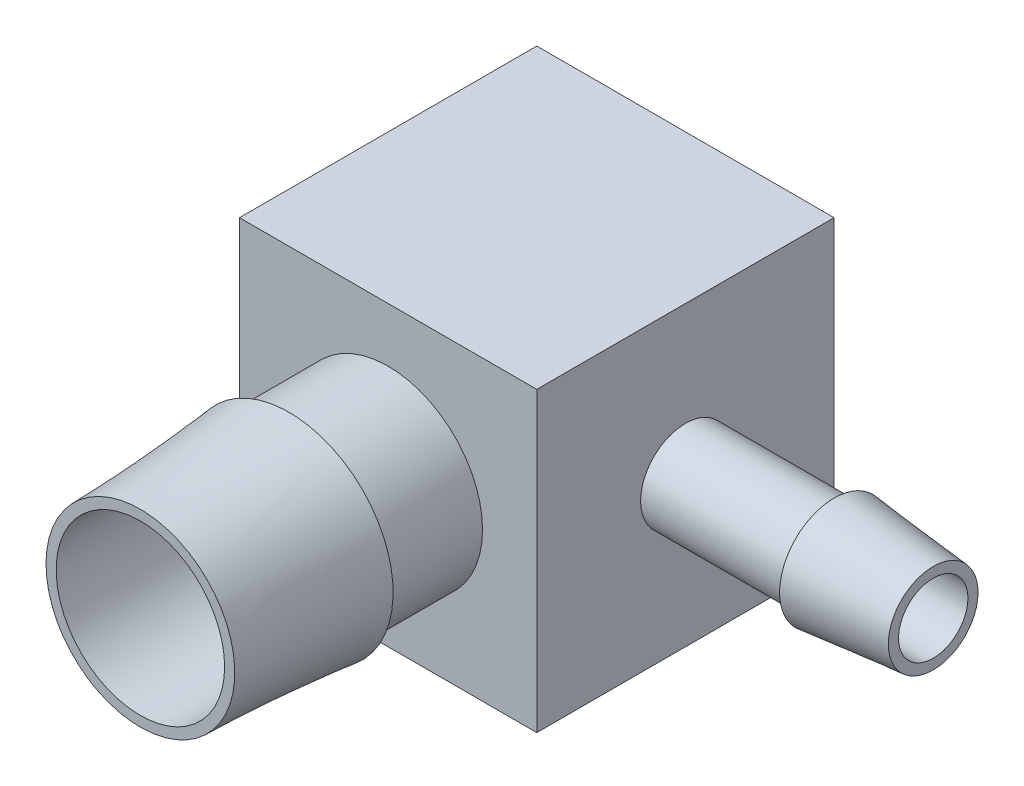
ISO-10303-21;
HEADER;
FILE_DESCRIPTION(('STEP AP214'),'2;1');
FILE_NAME('part.step','',(''),(''),'','','');
FILE_SCHEMA(('AUTOMOTIVE_DESIGN { 1 0 10303 214 1 1 1 1 }'));
ENDSEC;
DATA;
#1=APPLICATION_CONTEXT('core data for automotive mechanical design processes');
#2=APPLICATION_PROTOCOL_DEFINITION('international standard','automotive_design',2000,#1);
#3=PRODUCT_CONTEXT('',#1,'mechanical');
#4=PRODUCT('Part','Part','',(#3));
#5=PRODUCT_RELATED_PRODUCT_CATEGORY('part','',(#4));
#6=PRODUCT_DEFINITION_FORMATION('','',#4);
#7=PRODUCT_DEFINITION_CONTEXT('part definition',#1,'design');
#8=PRODUCT_DEFINITION('design','',#6,#7);
#9=PRODUCT_DEFINITION_SHAPE('','',#8);
#10=(LENGTH_UNIT() NAMED_UNIT(*) SI_UNIT(.MILLI.,.METRE.));
#11=(NAMED_UNIT(*) PLANE_ANGLE_UNIT() SI_UNIT($,.RADIAN.));
#12=(NAMED_UNIT(*) SI_UNIT($,.STERADIAN.) SOLID_ANGLE_UNIT());
#13=UNCERTAINTY_MEASURE_WITH_UNIT(LENGTH_MEASURE(1.E-05),#10,'distance_accuracy_value','');
#14=(GEOMETRIC_REPRESENTATION_CONTEXT(3) GLOBAL_UNCERTAINTY_ASSIGNED_CONTEXT((#13)) GLOBAL_UNIT_ASSIGNED_CONTEXT((#10,
#11,#12)) REPRESENTATION_CONTEXT('',''));
#15=CARTESIAN_POINT('',(0.,0.,0.));
#16=DIRECTION('',(0.,0.,1.));
#17=DIRECTION('',(1.,0.,0.));
#18=AXIS2_PLACEMENT_3D('',#15,#16,#17);
#19=CARTESIAN_POINT('',(40.,0.,0.));
#20=DIRECTION('',(-1.,0.,0.));
#21=DIRECTION('',(0.,-1.,0.));
#22=AXIS2_PLACEMENT_3D('',#19,#20,#21);
#23=CYLINDRICAL_SURFACE('',#22,4.525);
#24=CARTESIAN_POINT('',(15.,0.,0.));
#25=DIRECTION('',(1.,0.,0.));
#26=DIRECTION('',(0.,1.,0.));
#27=AXIS2_PLACEMENT_3D('',#24,#25,#26);
#28=CIRCLE('',#27,4.525);
#29=CARTESIAN_POINT('',(15.,4.525,0.));
#30=VERTEX_POINT('',#29);
#31=EDGE_CURVE('E49',#30,#30,#28,.T.);
#32=ORIENTED_EDGE('',*,*,#31,.T.);
#33=EDGE_LOOP('',(#32));
#34=FACE_BOUND('',#33,.T.);
#35=CARTESIAN_POINT('',(30.,0.,0.));
#36=DIRECTION('',(1.,0.,0.));
#37=DIRECTION('',(0.,1.,0.));
#38=AXIS2_PLACEMENT_3D('',#35,#36,#37);
#39=CIRCLE('',#38,4.525);
#40=CARTESIAN_POINT('',(30.,4.52500000000001,0.));
#41=VERTEX_POINT('',#40);
#42=EDGE_CURVE('E12',#41,#41,#39,.T.);
#43=ORIENTED_EDGE('',*,*,#42,.F.);
#44=EDGE_LOOP('',(#43));
#45=FACE_BOUND('',#44,.T.);
#46=ADVANCED_FACE('F40',(#34,#45),#23,.T.);
#47=CARTESIAN_POINT('',(13.,15.,15.));
#48=DIRECTION('',(-1.,0.,0.));
#49=DIRECTION('',(0.,-1.,0.));
#50=AXIS2_PLACEMENT_3D('',#47,#48,#49);
#51=PLANE('',#50);
#52=CARTESIAN_POINT('',(13.,0.,0.));
#53=DIRECTION('',(-1.,0.,0.));
#54=DIRECTION('',(0.,-1.,0.));
#55=AXIS2_PLACEMENT_3D('',#52,#53,#54);
#56=CIRCLE('',#55,3.5);
#57=CARTESIAN_POINT('',(13.,-3.5,0.));
#58=VERTEX_POINT('',#57);
#59=EDGE_CURVE('E202',#58,#58,#56,.T.);
#60=ORIENTED_EDGE('',*,*,#59,.F.);
#61=EDGE_LOOP('',(#60));
#62=FACE_BOUND('',#61,.T.);
#63=DIRECTION('',(0.,1.,0.));
#64=VECTOR('',#63,1.);
#65=CARTESIAN_POINT('',(13.,15.,-13.));
#66=LINE('',#65,#64);
#67=CARTESIAN_POINT('',(13.,-13.,-13.));
#68=VERTEX_POINT('',#67);
#69=CARTESIAN_POINT('',(13.,13.,-13.));
#70=VERTEX_POINT('',#69);
#71=EDGE_CURVE('E154',#68,#70,#66,.T.);
#72=ORIENTED_EDGE('',*,*,#71,.F.);
#73=DIRECTION('',(0.,0.,-1.));
#74=VECTOR('',#73,1.);
#75=CARTESIAN_POINT('',(13.,-13.,15.));
#76=LINE('',#75,#74);
#77=CARTESIAN_POINT('',(13.,-13.,13.));
#78=VERTEX_POINT('',#77);
#79=EDGE_CURVE('E175',#78,#68,#76,.T.);
#80=ORIENTED_EDGE('',*,*,#79,.F.);
#81=DIRECTION('',(0.,1.,0.));
#82=VECTOR('',#81,1.);
#83=CARTESIAN_POINT('',(13.,15.,13.));
#84=LINE('',#83,#82);
#85=CARTESIAN_POINT('',(13.,13.,13.));
#86=VERTEX_POINT('',#85);
#87=EDGE_CURVE('E161',#78,#86,#84,.T.);
#88=ORIENTED_EDGE('',*,*,#87,.T.);
#89=DIRECTION('',(0.,0.,-1.));
#90=VECTOR('',#89,1.);
#91=CARTESIAN_POINT('',(13.,13.,15.));
#92=LINE('',#91,#90);
#93=EDGE_CURVE('E172',#86,#70,#92,.T.);
#94=ORIENTED_EDGE('',*,*,#93,.T.);
#95=EDGE_LOOP('',(#72,#80,#88,#94));
#96=FACE_BOUND('',#95,.T.);
#97=ADVANCED_FACE('F311',(#62,#96),#51,.T.);
#98=CARTESIAN_POINT('',(-15.,13.,15.));
#99=DIRECTION('',(0.,-1.,0.));
#100=DIRECTION('',(0.,0.,-1.));
#101=AXIS2_PLACEMENT_3D('',#98,#99,#100);
#102=PLANE('',#101);
#103=DIRECTION('',(-1.,0.,0.));
#104=VECTOR('',#103,1.);
#105=CARTESIAN_POINT('',(-15.,13.,-13.));
#106=LINE('',#105,#104);
#107=CARTESIAN_POINT('',(-13.,13.,-13.));
#108=VERTEX_POINT('',#107);
#109=EDGE_CURVE('E57',#70,#108,#106,.T.);
#110=ORIENTED_EDGE('',*,*,#109,.F.);
#111=ORIENTED_EDGE('',*,*,#93,.F.);
#112=DIRECTION('',(-1.,0.,0.));
#113=VECTOR('',#112,1.);
#114=CARTESIAN_POINT('',(-15.,13.,13.));
#115=LINE('',#114,#113);
#116=CARTESIAN_POINT('',(-13.,13.,13.));
#117=VERTEX_POINT('',#116);
#118=EDGE_CURVE('E81',#86,#117,#115,.T.);
#119=ORIENTED_EDGE('',*,*,#118,.T.);
#120=DIRECTION('',(0.,0.,-1.));
#121=VECTOR('',#120,1.);
#122=CARTESIAN_POINT('',(-13.,13.,15.));
#123=LINE('',#122,#121);
#124=EDGE_CURVE('E168',#117,#108,#123,.T.);
#125=ORIENTED_EDGE('',*,*,#124,.T.);
#126=EDGE_LOOP('',(#110,#111,#119,#125));
#127=FACE_BOUND('',#126,.T.);
#128=ADVANCED_FACE('F316',(#127),#102,.T.);
#129=CARTESIAN_POINT('',(-13.,15.,15.));
#130=DIRECTION('',(1.,0.,0.));
#131=DIRECTION('',(0.,1.,0.));
#132=AXIS2_PLACEMENT_3D('',#129,#130,#131);
#133=PLANE('',#132);
#134=DIRECTION('',(0.,-1.,0.));
#135=VECTOR('',#134,1.);
#136=CARTESIAN_POINT('',(-13.,15.,-13.));
#137=LINE('',#136,#135);
#138=CARTESIAN_POINT('',(-13.,-13.,-13.));
#139=VERTEX_POINT('',#138);
#140=EDGE_CURVE('E170',#108,#139,#137,.T.);
#141=ORIENTED_EDGE('',*,*,#140,.F.);
#142=ORIENTED_EDGE('',*,*,#124,.F.);
#143=DIRECTION('',(0.,-1.,0.));
#144=VECTOR('',#143,1.);
#145=CARTESIAN_POINT('',(-13.,15.,13.));
#146=LINE('',#145,#144);
#147=CARTESIAN_POINT('',(-13.,-13.,13.));
#148=VERTEX_POINT('',#147);
#149=EDGE_CURVE('E158',#117,#148,#146,.T.);
#150=ORIENTED_EDGE('',*,*,#149,.T.);
#151=DIRECTION('',(0.,0.,-1.));
#152=VECTOR('',#151,1.);
#153=CARTESIAN_POINT('',(-13.,-13.,15.));
#154=LINE('',#153,#152);
#155=EDGE_CURVE('E163',#148,#139,#154,.T.);
#156=ORIENTED_EDGE('',*,*,#155,.T.);
#157=EDGE_LOOP('',(#141,#142,#150,#156));
#158=FACE_BOUND('',#157,.T.);
#159=ADVANCED_FACE('F344',(#158),#133,.T.);
#160=CARTESIAN_POINT('',(-15.,-13.,15.));
#161=DIRECTION('',(0.,1.,0.));
#162=DIRECTION('',(0.,0.,1.));
#163=AXIS2_PLACEMENT_3D('',#160,#161,#162);
#164=PLANE('',#163);
#165=DIRECTION('',(1.,0.,0.));
#166=VECTOR('',#165,1.);
#167=CARTESIAN_POINT('',(-15.,-13.,-13.));
#168=LINE('',#167,#166);
#169=EDGE_CURVE('E166',#139,#68,#168,.T.);
#170=ORIENTED_EDGE('',*,*,#169,.F.);
#171=ORIENTED_EDGE('',*,*,#155,.F.);
#172=DIRECTION('',(1.,0.,0.));
#173=VECTOR('',#172,1.);
#174=CARTESIAN_POINT('',(-15.,-13.,13.));
#175=LINE('',#174,#173);
#176=EDGE_CURVE('E155',#148,#78,#175,.T.);
#177=ORIENTED_EDGE('',*,*,#176,.T.);
#178=ORIENTED_EDGE('',*,*,#79,.T.);
#179=EDGE_LOOP('',(#170,#171,#177,#178));
#180=FACE_BOUND('',#179,.T.);
#181=ADVANCED_FACE('F347',(#180),#164,.T.);
#182=CARTESIAN_POINT('',(0.,0.,13.));
#183=DIRECTION('',(0.,0.,1.));
#184=DIRECTION('',(1.,0.,0.));
#185=AXIS2_PLACEMENT_3D('',#182,#183,#184);
#186=PLANE('',#185);
#187=CARTESIAN_POINT('',(0.,0.,13.));
#188=DIRECTION('',(0.,0.,1.));
#189=DIRECTION('',(1.,0.,0.));
#190=AXIS2_PLACEMENT_3D('',#187,#188,#189);
#191=CIRCLE('',#190,8.5);
#192=CARTESIAN_POINT('',(8.5,0.,13.));
#193=VERTEX_POINT('',#192);
#194=EDGE_CURVE('E147',#193,#193,#191,.T.);
#195=ORIENTED_EDGE('',*,*,#194,.T.);
#196=EDGE_LOOP('',(#195));
#197=FACE_BOUND('',#196,.T.);
#198=ORIENTED_EDGE('',*,*,#87,.F.);
#199=ORIENTED_EDGE('',*,*,#176,.F.);
#200=ORIENTED_EDGE('',*,*,#149,.F.);
#201=ORIENTED_EDGE('',*,*,#118,.F.);
#202=EDGE_LOOP('',(#198,#199,#200,#201));
#203=FACE_BOUND('',#202,.T.);
#204=ADVANCED_FACE('F350',(#197,#203),#186,.F.);
#205=CARTESIAN_POINT('',(0.,0.,-13.));
#206=DIRECTION('',(0.,0.,1.));
#207=DIRECTION('',(1.,0.,0.));
#208=AXIS2_PLACEMENT_3D('',#205,#206,#207);
#209=PLANE('',#208);
#210=ORIENTED_EDGE('',*,*,#71,.T.);
#211=ORIENTED_EDGE('',*,*,#109,.T.);
#212=ORIENTED_EDGE('',*,*,#140,.T.);
#213=ORIENTED_EDGE('',*,*,#169,.T.);
#214=EDGE_LOOP('',(#210,#211,#212,#213));
#215=FACE_BOUND('',#214,.T.);
#216=ADVANCED_FACE('F42',(#215),#209,.T.);
#217=CARTESIAN_POINT('',(0.,0.,10.));
#218=DIRECTION('',(0.,0.,1.));
#219=DIRECTION('',(1.,0.,0.));
#220=AXIS2_PLACEMENT_3D('',#217,#218,#219);
#221=CYLINDRICAL_SURFACE('',#220,8.5);
#222=CARTESIAN_POINT('',(0.,0.,40.));
#223=DIRECTION('',(0.,0.,1.));
#224=DIRECTION('',(1.,0.,0.));
#225=AXIS2_PLACEMENT_3D('',#222,#223,#224);
#226=CIRCLE('',#225,8.5);
#227=CARTESIAN_POINT('',(8.5,0.,40.));
#228=VERTEX_POINT('',#227);
#229=EDGE_CURVE('E180',#228,#228,#226,.T.);
#230=ORIENTED_EDGE('',*,*,#229,.T.);
#231=EDGE_LOOP('',(#230));
#232=FACE_BOUND('',#231,.T.);
#233=ORIENTED_EDGE('',*,*,#194,.F.);
#234=EDGE_LOOP('',(#233));
#235=FACE_BOUND('',#234,.T.);
#236=ADVANCED_FACE('F233',(#232,#235),#221,.F.);
#237=CARTESIAN_POINT('',(0.,0.,40.));
#238=DIRECTION('',(0.,0.,1.));
#239=DIRECTION('',(1.,0.,0.));
#240=AXIS2_PLACEMENT_3D('',#237,#238,#239);
#241=PLANE('',#240);
#242=CARTESIAN_POINT('',(0.,0.,40.));
#243=DIRECTION('',(0.,0.,-1.));
#244=DIRECTION('',(1.,0.,0.));
#245=AXIS2_PLACEMENT_3D('',#242,#243,#244);
#246=CIRCLE('',#245,9.525);
#247=CARTESIAN_POINT('',(6.73095891560813,6.73942260704843,40.));
#248=VERTEX_POINT('',#247);
#249=EDGE_CURVE('E199',#248,#248,#246,.T.);
#250=ORIENTED_EDGE('',*,*,#249,.F.);
#251=EDGE_LOOP('',(#250));
#252=FACE_BOUND('',#251,.T.);
#253=ORIENTED_EDGE('',*,*,#229,.F.);
#254=EDGE_LOOP('',(#253));
#255=FACE_BOUND('',#254,.T.);
#256=ADVANCED_FACE('F221',(#252,#255),#241,.T.);
#257=CARTESIAN_POINT('',(6.75481912017124,6.7112283872769,40.15));
#258=CARTESIAN_POINT('',(6.73095891560813,6.73942260704843,40.));
#259=CARTESIAN_POINT('',(4.3449384592966,9.55884458420186,25.));
#260=CARTESIAN_POINT('',(20.177275894725,-6.79840985306559,40.15));
#261=CARTESIAN_POINT('',(20.209804129705,-6.72249522416782,40.));
#262=CARTESIAN_POINT('',(23.4626276277003,0.86896766560866,25.));
#263=CARTESIAN_POINT('',(6.66763765438255,-20.2208666276194,40.15));
#264=CARTESIAN_POINT('',(6.74788629848873,-20.2013404382647,40.));
#265=CARTESIAN_POINT('',(14.7727507091071,-18.2487215027951,25.));
#266=CARTESIAN_POINT('',(-6.75481912017124,-6.7112283872769,40.15));
#267=CARTESIAN_POINT('',(-6.73095891560813,-6.73942260704843,40.));
#268=CARTESIAN_POINT('',(-4.3449384592966,-9.55884458420186,25.));
#269=CARTESIAN_POINT('',(-20.177275894725,6.79840985306559,40.15));
#270=CARTESIAN_POINT('',(-20.209804129705,6.72249522416782,40.));
#271=CARTESIAN_POINT('',(-23.4626276277003,-0.868967665608657,25.));
#272=CARTESIAN_POINT('',(-6.66763765438255,20.2208666276194,40.15));
#273=CARTESIAN_POINT('',(-6.74788629848873,20.2013404382647,40.));
#274=CARTESIAN_POINT('',(-14.7727507091071,18.2487215027951,25.));
#275=CARTESIAN_POINT('',(6.75481912017124,6.7112283872769,40.15));
#276=CARTESIAN_POINT('',(6.73095891560813,6.73942260704843,40.));
#277=CARTESIAN_POINT('',(4.3449384592966,9.55884458420186,25.));
#278=(BOUNDED_SURFACE() B_SPLINE_SURFACE(3,1,((#257,#258,#259),(#260,#261,#262),(#263,#264,
#265),(#266,#267,#268),(#269,#270,#271),(#272,#273,#274),(#275,#276,#277)),.UNSPECIFIED.,.T.,
.F.,.F.) B_SPLINE_SURFACE_WITH_KNOTS((4,3,4),(2,1,2),(0.,0.5,1.),(-0.01,0.,1.),
.UNSPECIFIED.) GEOMETRIC_REPRESENTATION_ITEM() RATIONAL_B_SPLINE_SURFACE(((1.,1.,1.),
(0.333333333333333,0.333333333333333,0.333333333333333),(0.333333333333333,0.333333333333333,
0.333333333333333),(1.,1.,1.),(0.333333333333333,0.333333333333333,0.333333333333333),
(0.333333333333333,0.333333333333333,0.333333333333333),(1.,1.,1.))) REPRESENTATION_ITEM('') SURFACE());
#279=CARTESIAN_POINT('',(0.,0.,25.));
#280=DIRECTION('',(0.,0.,1.));
#281=DIRECTION('',(1.,0.,0.));
#282=AXIS2_PLACEMENT_3D('',#279,#280,#281);
#283=CIRCLE('',#282,10.5);
#284=CARTESIAN_POINT('',(4.3449384592966,9.55884458420186,25.));
#285=VERTEX_POINT('',#284);
#286=EDGE_CURVE('E194',#285,#285,#283,.T.);
#287=CARTESIAN_POINT('',(6.73095891560813,6.73942260704843,40.));
#288=CARTESIAN_POINT('',(6.70610453585488,6.76879158597711,39.84375));
#289=CARTESIAN_POINT('',(6.68125015610164,6.79816056490579,39.6875));
#290=CARTESIAN_POINT('',(6.63154139659515,6.85689852276316,39.375));
#291=CARTESIAN_POINT('',(6.6066870168419,6.88626750169184,39.21875));
#292=CARTESIAN_POINT('',(6.55697825733541,6.9450054595492,38.90625));
#293=CARTESIAN_POINT('',(6.53212387758217,6.97437443847788,38.75));
#294=CARTESIAN_POINT('',(6.48241511807568,7.03311239633525,38.4375));
#295=CARTESIAN_POINT('',(6.45756073832243,7.06248137526393,38.28125));
#296=CARTESIAN_POINT('',(6.40785197881594,7.12121933312129,37.96875));
#297=CARTESIAN_POINT('',(6.3829975990627,7.15058831204997,37.8125));
#298=CARTESIAN_POINT('',(6.33328883955621,7.20932626990734,37.5));
#299=CARTESIAN_POINT('',(6.30843445980296,7.23869524883602,37.34375));
#300=CARTESIAN_POINT('',(6.25872570029647,7.29743320669338,37.03125));
#301=CARTESIAN_POINT('',(6.23387132054323,7.32680218562206,36.875));
#302=CARTESIAN_POINT('',(6.18416256103674,7.38554014347943,36.5625));
#303=CARTESIAN_POINT('',(6.15930818128349,7.41490912240811,36.40625));
#304=CARTESIAN_POINT('',(6.109599421777,7.47364708026547,36.09375));
#305=CARTESIAN_POINT('',(6.08474504202376,7.50301605919415,35.9375));
#306=CARTESIAN_POINT('',(6.03503628251727,7.56175401705152,35.625));
#307=CARTESIAN_POINT('',(6.01018190276402,7.5911229959802,35.46875));
#308=CARTESIAN_POINT('',(5.96047314325753,7.64986095383756,35.15625));
#309=CARTESIAN_POINT('',(5.93561876350429,7.67922993276624,35.));
#310=CARTESIAN_POINT('',(5.8859100039978,7.7379678906236,34.6875));
#311=CARTESIAN_POINT('',(5.86105562424455,7.76733686955229,34.53125));
#312=CARTESIAN_POINT('',(5.81134686473806,7.82607482740965,34.21875));
#313=CARTESIAN_POINT('',(5.78649248498481,7.85544380633833,34.0625));
#314=CARTESIAN_POINT('',(5.73678372547833,7.91418176419569,33.75));
#315=CARTESIAN_POINT('',(5.71192934572508,7.94355074312438,33.59375));
#316=CARTESIAN_POINT('',(5.66222058621859,8.00228870098174,33.28125));
#317=CARTESIAN_POINT('',(5.63736620646534,8.03165767991042,33.125));
#318=CARTESIAN_POINT('',(5.58765744695885,8.09039563776778,32.8125));
#319=CARTESIAN_POINT('',(5.56280306720561,8.11976461669646,32.65625));
#320=CARTESIAN_POINT('',(5.51309430769912,8.17850257455383,32.34375));
#321=CARTESIAN_POINT('',(5.48823992794587,8.20787155348251,32.1875));
#322=CARTESIAN_POINT('',(5.43853116843938,8.26660951133987,31.875));
#323=CARTESIAN_POINT('',(5.41367678868614,8.29597849026856,31.71875));
#324=CARTESIAN_POINT('',(5.36396802917965,8.35471644812592,31.40625));
#325=CARTESIAN_POINT('',(5.3391136494264,8.3840854270546,31.25));
#326=CARTESIAN_POINT('',(5.28940488991991,8.44282338491196,30.9375));
#327=CARTESIAN_POINT('',(5.26455051016667,8.47219236384064,30.78125));
#328=CARTESIAN_POINT('',(5.21484175066018,8.53093032169801,30.46875));
#329=CARTESIAN_POINT('',(5.18998737090693,8.56029930062669,30.3125));
#330=CARTESIAN_POINT('',(5.14027861140044,8.61903725848405,30.));
#331=CARTESIAN_POINT('',(5.1154242316472,8.64840623741273,29.84375));
#332=CARTESIAN_POINT('',(5.06571547214071,8.7071441952701,29.53125));
#333=CARTESIAN_POINT('',(5.04086109238746,8.73651317419878,29.375));
#334=CARTESIAN_POINT('',(4.99115233288097,8.79525113205614,29.0625));
#335=CARTESIAN_POINT('',(4.96629795312773,8.82462011098482,28.90625));
#336=CARTESIAN_POINT('',(4.91658919362124,8.88335806884219,28.59375));
#337=CARTESIAN_POINT('',(4.89173481386799,8.91272704777087,28.4375));
#338=CARTESIAN_POINT('',(4.8420260543615,8.97146500562823,28.125));
#339=CARTESIAN_POINT('',(4.81717167460826,9.00083398455691,27.96875));
#340=CARTESIAN_POINT('',(4.76746291510177,9.05957194241428,27.65625));
#341=CARTESIAN_POINT('',(4.74260853534852,9.08894092134296,27.5));
#342=CARTESIAN_POINT('',(4.69289977584203,9.14767887920032,27.1875));
#343=CARTESIAN_POINT('',(4.66804539608879,9.177047858129,27.03125));
#344=CARTESIAN_POINT('',(4.6183366365823,9.23578581598636,26.71875));
#345=CARTESIAN_POINT('',(4.59348225682905,9.26515479491505,26.5625));
#346=CARTESIAN_POINT('',(4.54377349732256,9.32389275277241,26.25));
#347=CARTESIAN_POINT('',(4.51891911756932,9.35326173170109,26.09375));
#348=CARTESIAN_POINT('',(4.46921035806283,9.41199968955845,25.78125));
#349=CARTESIAN_POINT('',(4.44435597830958,9.44136866848714,25.625));
#350=CARTESIAN_POINT('',(4.39464721880309,9.5001066263445,25.3125));
#351=CARTESIAN_POINT('',(4.36979283904985,9.52947560527318,25.15625));
#352=CARTESIAN_POINT('',(4.3449384592966,9.55884458420186,25.));
#353=B_SPLINE_CURVE_WITH_KNOTS('',3,(#287,#288,#289,#290,#291,#292,#293,#294,#295,#296,#297,
#298,#299,#300,#301,#302,#303,#304,#305,#306,#307,#308,#309,#310,#311,#312,#313,#314,#315,#316,
#317,#318,#319,#320,#321,#322,#323,#324,#325,#326,#327,#328,#329,#330,#331,#332,#333,#334,#335,
#336,#337,#338,#339,#340,#341,#342,#343,#344,#345,#346,#347,#348,#349,#350,#351,#352),
.UNSPECIFIED.,.F.,.F.,(4,2,2,2,2,2,2,2,2,2,2,2,2,2,2,2,2,2,2,2,2,2,2,2,2,2,2,2,2,2,2,2,4),(0.,
0.482751547430032,0.965503094860064,1.44825464229009,1.93100618972012,2.41375773715015,
2.89650928458017,3.3792608320102,3.86201237944023,4.34476392687026,4.82751547430029,
5.31026702173031,5.79301856916034,6.27577011659037,6.75852166402041,7.24127321145042,
7.72402475888046,8.20677630631049,8.68952785374051,9.17227940117054,9.65503094860057,
10.1377824960306,10.6205340434606,11.1032855908907,11.5860371383207,12.0687886857507,
12.5515402331807,13.0342917806108,13.5170433280408,13.9997948754708,14.4825464229008,
14.9652979703309,15.4480495177609),.UNSPECIFIED.);
#354=EDGE_CURVE('BSEAM208',#248,#285,#353,.T.);
#355=ORIENTED_EDGE('',*,*,#249,.T.);
#356=ORIENTED_EDGE('',*,*,#286,.T.);
#357=ORIENTED_EDGE('',*,*,#354,.T.);
#358=ORIENTED_EDGE('',*,*,#354,.F.);
#359=EDGE_LOOP('',(#355,#357,#356,#358));
#360=FACE_BOUND('',#359,.T.);
#361=ADVANCED_FACE('F208',(#360),#278,.T.);
#362=CARTESIAN_POINT('',(0.,0.,25.));
#363=DIRECTION('',(0.,0.,1.));
#364=DIRECTION('',(1.,0.,0.));
#365=AXIS2_PLACEMENT_3D('',#362,#363,#364);
#366=PLANE('',#365);
#367=CARTESIAN_POINT('',(0.,0.,25.));
#368=DIRECTION('',(0.,0.,1.));
#369=DIRECTION('',(1.,0.,0.));
#370=AXIS2_PLACEMENT_3D('',#367,#368,#369);
#371=CIRCLE('',#370,9.525);
#372=CARTESIAN_POINT('',(9.525,0.,25.));
#373=VERTEX_POINT('',#372);
#374=EDGE_CURVE('E181',#373,#373,#371,.T.);
#375=ORIENTED_EDGE('',*,*,#374,.T.);
#376=EDGE_LOOP('',(#375));
#377=FACE_BOUND('',#376,.T.);
#378=ORIENTED_EDGE('',*,*,#286,.F.);
#379=EDGE_LOOP('',(#378));
#380=FACE_BOUND('',#379,.T.);
#381=ADVANCED_FACE('F220',(#377,#380),#366,.F.);
#382=CARTESIAN_POINT('',(0.,0.,-15.));
#383=DIRECTION('',(0.,0.,1.));
#384=DIRECTION('',(1.,0.,0.));
#385=AXIS2_PLACEMENT_3D('',#382,#383,#384);
#386=PLANE('',#385);
#387=DIRECTION('',(0.,1.,0.));
#388=VECTOR('',#387,1.);
#389=CARTESIAN_POINT('',(15.,15.,-15.));
#390=LINE('',#389,#388);
#391=CARTESIAN_POINT('',(15.,-15.,-15.));
#392=VERTEX_POINT('',#391);
#393=CARTESIAN_POINT('',(15.,15.,-15.));
#394=VERTEX_POINT('',#393);
#395=EDGE_CURVE('E144',#392,#394,#390,.T.);
#396=ORIENTED_EDGE('',*,*,#395,.F.);
#397=DIRECTION('',(1.,0.,0.));
#398=VECTOR('',#397,1.);
#399=CARTESIAN_POINT('',(-15.,-15.,-15.));
#400=LINE('',#399,#398);
#401=CARTESIAN_POINT('',(-15.,-15.,-15.));
#402=VERTEX_POINT('',#401);
#403=EDGE_CURVE('E116',#402,#392,#400,.T.);
#404=ORIENTED_EDGE('',*,*,#403,.F.);
#405=DIRECTION('',(0.,-1.,0.));
#406=VECTOR('',#405,1.);
#407=CARTESIAN_POINT('',(-15.,15.,-15.));
#408=LINE('',#407,#406);
#409=CARTESIAN_POINT('',(-15.,15.,-15.));
#410=VERTEX_POINT('',#409);
#411=EDGE_CURVE('E110',#410,#402,#408,.T.);
#412=ORIENTED_EDGE('',*,*,#411,.F.);
#413=DIRECTION('',(-1.,0.,0.));
#414=VECTOR('',#413,1.);
#415=CARTESIAN_POINT('',(-15.,15.,-15.));
#416=LINE('',#415,#414);
#417=EDGE_CURVE('E134',#394,#410,#416,.T.);
#418=ORIENTED_EDGE('',*,*,#417,.F.);
#419=EDGE_LOOP('',(#396,#404,#412,#418));
#420=FACE_BOUND('',#419,.T.);
#421=ADVANCED_FACE('F232',(#420),#386,.F.);
#422=CARTESIAN_POINT('',(-15.,-15.,15.));
#423=DIRECTION('',(0.,1.,0.));
#424=DIRECTION('',(0.,0.,1.));
#425=AXIS2_PLACEMENT_3D('',#422,#423,#424);
#426=PLANE('',#425);
#427=ORIENTED_EDGE('',*,*,#403,.T.);
#428=DIRECTION('',(0.,0.,-1.));
#429=VECTOR('',#428,1.);
#430=CARTESIAN_POINT('',(15.,-15.,15.));
#431=LINE('',#430,#429);
#432=CARTESIAN_POINT('',(15.,-15.,15.));
#433=VERTEX_POINT('',#432);
#434=EDGE_CURVE('E140',#433,#392,#431,.T.);
#435=ORIENTED_EDGE('',*,*,#434,.F.);
#436=DIRECTION('',(1.,0.,0.));
#437=VECTOR('',#436,1.);
#438=CARTESIAN_POINT('',(-15.,-15.,15.));
#439=LINE('',#438,#437);
#440=CARTESIAN_POINT('',(-15.,-15.,15.));
#441=VERTEX_POINT('',#440);
#442=EDGE_CURVE('E93',#441,#433,#439,.T.);
#443=ORIENTED_EDGE('',*,*,#442,.F.);
#444=DIRECTION('',(0.,0.,-1.));
#445=VECTOR('',#444,1.);
#446=CARTESIAN_POINT('',(-15.,-15.,15.));
#447=LINE('',#446,#445);
#448=EDGE_CURVE('E136',#441,#402,#447,.T.);
#449=ORIENTED_EDGE('',*,*,#448,.T.);
#450=EDGE_LOOP('',(#427,#435,#443,#449));
#451=FACE_BOUND('',#450,.T.);
#452=ADVANCED_FACE('F330',(#451),#426,.F.);
#453=CARTESIAN_POINT('',(-15.,15.,15.));
#454=DIRECTION('',(1.,0.,0.));
#455=DIRECTION('',(0.,1.,0.));
#456=AXIS2_PLACEMENT_3D('',#453,#454,#455);
#457=PLANE('',#456);
#458=ORIENTED_EDGE('',*,*,#411,.T.);
#459=ORIENTED_EDGE('',*,*,#448,.F.);
#460=DIRECTION('',(0.,-1.,0.));
#461=VECTOR('',#460,1.);
#462=CARTESIAN_POINT('',(-15.,15.,15.));
#463=LINE('',#462,#461);
#464=CARTESIAN_POINT('',(-15.,15.,15.));
#465=VERTEX_POINT('',#464);
#466=EDGE_CURVE('E127',#465,#441,#463,.T.);
#467=ORIENTED_EDGE('',*,*,#466,.F.);
#468=DIRECTION('',(0.,0.,-1.));
#469=VECTOR('',#468,1.);
#470=CARTESIAN_POINT('',(-15.,15.,15.));
#471=LINE('',#470,#469);
#472=EDGE_CURVE('E132',#465,#410,#471,.T.);
#473=ORIENTED_EDGE('',*,*,#472,.T.);
#474=EDGE_LOOP('',(#458,#459,#467,#473));
#475=FACE_BOUND('',#474,.T.);
#476=ADVANCED_FACE('F138',(#475),#457,.F.);
#477=CARTESIAN_POINT('',(-15.,15.,15.));
#478=DIRECTION('',(0.,-1.,0.));
#479=DIRECTION('',(0.,0.,-1.));
#480=AXIS2_PLACEMENT_3D('',#477,#478,#479);
#481=PLANE('',#480);
#482=ORIENTED_EDGE('',*,*,#417,.T.);
#483=ORIENTED_EDGE('',*,*,#472,.F.);
#484=DIRECTION('',(-1.,0.,0.));
#485=VECTOR('',#484,1.);
#486=CARTESIAN_POINT('',(-15.,15.,15.));
#487=LINE('',#486,#485);
#488=CARTESIAN_POINT('',(15.,15.,15.));
#489=VERTEX_POINT('',#488);
#490=EDGE_CURVE('E124',#489,#465,#487,.T.);
#491=ORIENTED_EDGE('',*,*,#490,.F.);
#492=DIRECTION('',(0.,0.,-1.));
#493=VECTOR('',#492,1.);
#494=CARTESIAN_POINT('',(15.,15.,15.));
#495=LINE('',#494,#493);
#496=EDGE_CURVE('E135',#489,#394,#495,.T.);
#497=ORIENTED_EDGE('',*,*,#496,.T.);
#498=EDGE_LOOP('',(#482,#483,#491,#497));
#499=FACE_BOUND('',#498,.T.);
#500=ADVANCED_FACE('F133',(#499),#481,.F.);
#501=CARTESIAN_POINT('',(15.,15.,15.));
#502=DIRECTION('',(-1.,0.,0.));
#503=DIRECTION('',(0.,-1.,0.));
#504=AXIS2_PLACEMENT_3D('',#501,#502,#503);
#505=PLANE('',#504);
#506=ORIENTED_EDGE('',*,*,#31,.F.);
#507=EDGE_LOOP('',(#506));
#508=FACE_BOUND('',#507,.T.);
#509=ORIENTED_EDGE('',*,*,#395,.T.);
#510=ORIENTED_EDGE('',*,*,#496,.F.);
#511=DIRECTION('',(0.,1.,0.));
#512=VECTOR('',#511,1.);
#513=CARTESIAN_POINT('',(15.,15.,15.));
#514=LINE('',#513,#512);
#515=EDGE_CURVE('E129',#433,#489,#514,.T.);
#516=ORIENTED_EDGE('',*,*,#515,.F.);
#517=ORIENTED_EDGE('',*,*,#434,.T.);
#518=EDGE_LOOP('',(#509,#510,#516,#517));
#519=FACE_BOUND('',#518,.T.);
#520=ADVANCED_FACE('F323',(#508,#519),#505,.F.);
#521=CARTESIAN_POINT('',(0.,0.,15.));
#522=DIRECTION('',(0.,0.,1.));
#523=DIRECTION('',(1.,0.,0.));
#524=AXIS2_PLACEMENT_3D('',#521,#522,#523);
#525=PLANE('',#524);
#526=CARTESIAN_POINT('',(0.,0.,15.));
#527=DIRECTION('',(0.,0.,1.));
#528=DIRECTION('',(1.,0.,0.));
#529=AXIS2_PLACEMENT_3D('',#526,#527,#528);
#530=CIRCLE('',#529,9.525);
#531=CARTESIAN_POINT('',(9.525,0.,15.));
#532=VERTEX_POINT('',#531);
#533=EDGE_CURVE('E157',#532,#532,#530,.T.);
#534=ORIENTED_EDGE('',*,*,#533,.F.);
#535=EDGE_LOOP('',(#534));
#536=FACE_BOUND('',#535,.T.);
#537=ORIENTED_EDGE('',*,*,#515,.T.);
#538=ORIENTED_EDGE('',*,*,#490,.T.);
#539=ORIENTED_EDGE('',*,*,#466,.T.);
#540=ORIENTED_EDGE('',*,*,#442,.T.);
#541=EDGE_LOOP('',(#537,#538,#539,#540));
#542=FACE_BOUND('',#541,.T.);
#543=ADVANCED_FACE('F125',(#536,#542),#525,.T.);
#544=CARTESIAN_POINT('',(0.,0.,40.));
#545=DIRECTION('',(0.,0.,-1.));
#546=DIRECTION('',(-1.,0.,0.));
#547=AXIS2_PLACEMENT_3D('',#544,#545,#546);
#548=CYLINDRICAL_SURFACE('',#547,9.525);
#549=ORIENTED_EDGE('',*,*,#533,.T.);
#550=EDGE_LOOP('',(#549));
#551=FACE_BOUND('',#550,.T.);
#552=ORIENTED_EDGE('',*,*,#374,.F.);
#553=EDGE_LOOP('',(#552));
#554=FACE_BOUND('',#553,.T.);
#555=ADVANCED_FACE('F302',(#551,#554),#548,.T.);
#556=CARTESIAN_POINT('',(40.,0.,0.));
#557=DIRECTION('',(1.,0.,0.));
#558=DIRECTION('',(0.,1.,0.));
#559=AXIS2_PLACEMENT_3D('',#556,#557,#558);
#560=PLANE('',#559);
#561=CARTESIAN_POINT('',(40.,0.,0.));
#562=DIRECTION('',(-1.,0.,0.));
#563=DIRECTION('',(0.,1.,0.));
#564=AXIS2_PLACEMENT_3D('',#561,#562,#563);
#565=CIRCLE('',#564,4.525);
#566=CARTESIAN_POINT('',(40.,4.19775170925776,-1.6895282144503));
#567=VERTEX_POINT('',#566);
#568=EDGE_CURVE('E256',#567,#567,#565,.T.);
#569=ORIENTED_EDGE('',*,*,#568,.F.);
#570=EDGE_LOOP('',(#569));
#571=FACE_BOUND('',#570,.T.);
#572=CARTESIAN_POINT('',(40.,0.,0.));
#573=DIRECTION('',(1.,0.,0.));
#574=DIRECTION('',(0.,1.,0.));
#575=AXIS2_PLACEMENT_3D('',#572,#573,#574);
#576=CIRCLE('',#575,3.5);
#577=CARTESIAN_POINT('',(40.,3.50000000000001,0.));
#578=VERTEX_POINT('',#577);
#579=EDGE_CURVE('E248',#578,#578,#576,.T.);
#580=ORIENTED_EDGE('',*,*,#579,.F.);
#581=EDGE_LOOP('',(#580));
#582=FACE_BOUND('',#581,.T.);
#583=ADVANCED_FACE('F299',(#571,#582),#560,.T.);
#584=CARTESIAN_POINT('',(9.99999999999999,0.,0.));
#585=DIRECTION('',(1.,0.,0.));
#586=DIRECTION('',(0.,1.,0.));
#587=AXIS2_PLACEMENT_3D('',#584,#585,#586);
#588=CYLINDRICAL_SURFACE('',#587,3.5);
#589=ORIENTED_EDGE('',*,*,#59,.T.);
#590=EDGE_LOOP('',(#589));
#591=FACE_BOUND('',#590,.T.);
#592=ORIENTED_EDGE('',*,*,#579,.T.);
#593=EDGE_LOOP('',(#592));
#594=FACE_BOUND('',#593,.T.);
#595=ADVANCED_FACE('F276',(#591,#594),#588,.F.);
#596=CARTESIAN_POINT('',(40.1,4.1858371984692,-1.69543944766651));
#597=CARTESIAN_POINT('',(40.,4.19775170925776,-1.6895282144503));
#598=CARTESIAN_POINT('',(30.,5.38920278811337,-1.09840489282923));
#599=CARTESIAN_POINT('',(40.1,0.794958303136181,-10.0671138446049));
#600=CARTESIAN_POINT('',(40.,0.818695280357158,-10.0850316329658));
#601=CARTESIAN_POINT('',(30.,3.19239300245491,-11.8768104690559));
#602=CARTESIAN_POINT('',(40.1,-7.57671609380221,-6.67623494927188));
#603=CARTESIAN_POINT('',(40.,-7.57680813815834,-6.7059752040652));
#604=CARTESIAN_POINT('',(30.,-7.58601257377181,-9.68000068339749));
#605=CARTESIAN_POINT('',(40.1,-4.18583719846919,1.69543944766651));
#606=CARTESIAN_POINT('',(40.,-4.19775170925774,1.6895282144503));
#607=CARTESIAN_POINT('',(30.,-5.38920278811335,1.09840489282923));
#608=CARTESIAN_POINT('',(40.1,-0.794958303136163,10.0671138446049));
#609=CARTESIAN_POINT('',(40.,-0.81869528035714,10.0850316329658));
#610=CARTESIAN_POINT('',(30.,-3.19239300245489,11.876810469056));
#611=CARTESIAN_POINT('',(40.1,7.57671609380223,6.67623494927188));
#612=CARTESIAN_POINT('',(40.,7.57680813815836,6.7059752040652));
#613=CARTESIAN_POINT('',(30.,7.58601257377183,9.68000068339749));
#614=CARTESIAN_POINT('',(40.1,4.1858371984692,-1.69543944766651));
#615=CARTESIAN_POINT('',(40.,4.19775170925776,-1.6895282144503));
#616=CARTESIAN_POINT('',(30.,5.38920278811337,-1.09840489282923));
#617=(BOUNDED_SURFACE() B_SPLINE_SURFACE(3,1,((#596,#597,#598),(#599,#600,#601),(#602,#603,
#604),(#605,#606,#607),(#608,#609,#610),(#611,#612,#613),(#614,#615,#616)),.UNSPECIFIED.,.T.,
.F.,.F.) B_SPLINE_SURFACE_WITH_KNOTS((4,3,4),(2,1,2),(0.,0.5,1.),(-0.01,0.,1.),
.UNSPECIFIED.) GEOMETRIC_REPRESENTATION_ITEM() RATIONAL_B_SPLINE_SURFACE(((1.,1.,1.),
(0.333333333333333,0.333333333333333,0.333333333333333),(0.333333333333333,0.333333333333333,
0.333333333333333),(1.,1.,1.),(0.333333333333333,0.333333333333333,0.333333333333333),
(0.333333333333333,0.333333333333333,0.333333333333333),(1.,1.,1.))) REPRESENTATION_ITEM('') SURFACE());
#618=CARTESIAN_POINT('',(30.,0.,0.));
#619=DIRECTION('',(1.,0.,0.));
#620=DIRECTION('',(0.,1.,0.));
#621=AXIS2_PLACEMENT_3D('',#618,#619,#620);
#622=CIRCLE('',#621,5.5);
#623=CARTESIAN_POINT('',(30.,5.38920278811337,-1.09840489282923));
#624=VERTEX_POINT('',#623);
#625=EDGE_CURVE('E251',#624,#624,#622,.T.);
#626=CARTESIAN_POINT('',(40.,4.19775170925776,-1.6895282144503));
#627=CARTESIAN_POINT('',(39.8958333333333,4.21016265799584,-1.68337067985008));
#628=CARTESIAN_POINT('',(39.7916666666667,4.22257360673392,-1.67721314524986));
#629=CARTESIAN_POINT('',(39.5833333333333,4.24739550421008,-1.66489807604942));
#630=CARTESIAN_POINT('',(39.4791666666667,4.25980645294816,-1.6587405414492));
#631=CARTESIAN_POINT('',(39.2708333333333,4.28462835042432,-1.64642547224877));
#632=CARTESIAN_POINT('',(39.1666666666667,4.2970392991624,-1.64026793764855));
#633=CARTESIAN_POINT('',(38.9583333333333,4.32186119663855,-1.62795286844811));
#634=CARTESIAN_POINT('',(38.8541666666667,4.33427214537663,-1.62179533384789));
#635=CARTESIAN_POINT('',(38.6458333333333,4.35909404285279,-1.60948026464745));
#636=CARTESIAN_POINT('',(38.5416666666667,4.37150499159087,-1.60332273004723));
#637=CARTESIAN_POINT('',(38.3333333333333,4.39632688906703,-1.59100766084679));
#638=CARTESIAN_POINT('',(38.2291666666667,4.40873783780511,-1.58485012624657));
#639=CARTESIAN_POINT('',(38.0208333333333,4.43355973528127,-1.57253505704613));
#640=CARTESIAN_POINT('',(37.9166666666667,4.44597068401935,-1.56637752244591));
#641=CARTESIAN_POINT('',(37.7083333333333,4.4707925814955,-1.55406245324547));
#642=CARTESIAN_POINT('',(37.6041666666667,4.48320353023358,-1.54790491864525));
#643=CARTESIAN_POINT('',(37.3958333333333,4.50802542770974,-1.53558984944481));
#644=CARTESIAN_POINT('',(37.2916666666667,4.52043637644782,-1.52943231484459));
#645=CARTESIAN_POINT('',(37.0833333333333,4.54525827392398,-1.51711724564416));
#646=CARTESIAN_POINT('',(36.9791666666667,4.55766922266206,-1.51095971104394));
#647=CARTESIAN_POINT('',(36.7708333333333,4.58249112013822,-1.4986446418435));
#648=CARTESIAN_POINT('',(36.6666666666667,4.5949020688763,-1.49248710724328));
#649=CARTESIAN_POINT('',(36.4583333333333,4.61972396635245,-1.48017203804284));
#650=CARTESIAN_POINT('',(36.3541666666667,4.63213491509053,-1.47401450344262));
#651=CARTESIAN_POINT('',(36.1458333333333,4.65695681256669,-1.46169943424218));
#652=CARTESIAN_POINT('',(36.0416666666667,4.66936776130477,-1.45554189964196));
#653=CARTESIAN_POINT('',(35.8333333333333,4.69418965878093,-1.44322683044152));
#654=CARTESIAN_POINT('',(35.7291666666667,4.70660060751901,-1.4370692958413));
#655=CARTESIAN_POINT('',(35.5208333333333,4.73142250499517,-1.42475422664086));
#656=CARTESIAN_POINT('',(35.4166666666667,4.74383345373325,-1.41859669204064));
#657=CARTESIAN_POINT('',(35.2083333333333,4.76865535120941,-1.4062816228402));
#658=CARTESIAN_POINT('',(35.1041666666667,4.78106629994748,-1.40012408823999));
#659=CARTESIAN_POINT('',(34.8958333333333,4.80588819742364,-1.38780901903955));
#660=CARTESIAN_POINT('',(34.7916666666667,4.81829914616172,-1.38165148443933));
#661=CARTESIAN_POINT('',(34.5833333333333,4.84312104363788,-1.36933641523889));
#662=CARTESIAN_POINT('',(34.4791666666667,4.85553199237596,-1.36317888063867));
#663=CARTESIAN_POINT('',(34.2708333333333,4.88035388985212,-1.35086381143823));
#664=CARTESIAN_POINT('',(34.1666666666667,4.8927648385902,-1.34470627683801));
#665=CARTESIAN_POINT('',(33.9583333333333,4.91758673606636,-1.33239120763757));
#666=CARTESIAN_POINT('',(33.8541666666667,4.92999768480444,-1.32623367303735));
#667=CARTESIAN_POINT('',(33.6458333333333,4.95481958228059,-1.31391860383691));
#668=CARTESIAN_POINT('',(33.5416666666667,4.96723053101867,-1.30776106923669));
#669=CARTESIAN_POINT('',(33.3333333333333,4.99205242849483,-1.29544600003625));
#670=CARTESIAN_POINT('',(33.2291666666667,5.00446337723291,-1.28928846543603));
#671=CARTESIAN_POINT('',(33.0208333333333,5.02928527470907,-1.2769733962356));
#672=CARTESIAN_POINT('',(32.9166666666667,5.04169622344715,-1.27081586163538));
#673=CARTESIAN_POINT('',(32.7083333333333,5.06651812092331,-1.25850079243494));
#674=CARTESIAN_POINT('',(32.6041666666667,5.07892906966139,-1.25234325783472));
#675=CARTESIAN_POINT('',(32.3958333333333,5.10375096713754,-1.24002818863428));
#676=CARTESIAN_POINT('',(32.2916666666667,5.11616191587562,-1.23387065403406));
#677=CARTESIAN_POINT('',(32.0833333333333,5.14098381335178,-1.22155558483362));
#678=CARTESIAN_POINT('',(31.9791666666667,5.15339476208986,-1.2153980502334));
#679=CARTESIAN_POINT('',(31.7708333333333,5.17821665956602,-1.20308298103296));
#680=CARTESIAN_POINT('',(31.6666666666667,5.1906276083041,-1.19692544643274));
#681=CARTESIAN_POINT('',(31.4583333333333,5.21544950578026,-1.1846103772323));
#682=CARTESIAN_POINT('',(31.3541666666667,5.22786045451834,-1.17845284263208));
#683=CARTESIAN_POINT('',(31.1458333333333,5.25268235199449,-1.16613777343164));
#684=CARTESIAN_POINT('',(31.0416666666667,5.26509330073257,-1.15998023883143));
#685=CARTESIAN_POINT('',(30.8333333333333,5.28991519820873,-1.14766516963099));
#686=CARTESIAN_POINT('',(30.7291666666667,5.30232614694681,-1.14150763503077));
#687=CARTESIAN_POINT('',(30.5208333333333,5.32714804442297,-1.12919256583033));
#688=CARTESIAN_POINT('',(30.4166666666667,5.33955899316105,-1.12303503123011));
#689=CARTESIAN_POINT('',(30.2083333333333,5.36438089063721,-1.11071996202967));
#690=CARTESIAN_POINT('',(30.1041666666667,5.37679183937529,-1.10456242742945));
#691=CARTESIAN_POINT('',(30.,5.38920278811337,-1.09840489282923));
#692=B_SPLINE_CURVE_WITH_KNOTS('',3,(#626,#627,#628,#629,#630,#631,#632,#633,#634,#635,#636,
#637,#638,#639,#640,#641,#642,#643,#644,#645,#646,#647,#648,#649,#650,#651,#652,#653,#654,#655,
#656,#657,#658,#659,#660,#661,#662,#663,#664,#665,#666,#667,#668,#669,#670,#671,#672,#673,#674,
#675,#676,#677,#678,#679,#680,#681,#682,#683,#684,#685,#686,#687,#688,#689,#690,#691),
.UNSPECIFIED.,.F.,.F.,(4,2,2,2,2,2,2,2,2,2,2,2,2,2,2,2,2,2,2,2,2,2,2,2,2,2,2,2,2,2,2,2,4),(0.,
0.315251918199374,0.630503836398756,0.945755754598137,1.26100767279753,1.5762595909969,
1.89151150919628,2.20676342739566,2.52201534559504,2.83726726379442,3.1525191819938,
3.46777110019319,3.78302301839257,4.09827493659195,4.41352685479133,4.72877877299071,
5.04403069119009,5.35928260938947,5.67453452758885,5.98978644578823,6.30503836398761,
6.620290282187,6.93554220038638,7.25079411858575,7.56604603678514,7.88129795498451,
8.1965498731839,8.51180179138328,8.82705370958266,9.14230562778204,9.45755754598142,
9.7728094641808,10.0880613823802),.UNSPECIFIED.);
#693=EDGE_CURVE('BSEAM264',#567,#624,#692,.T.);
#694=ORIENTED_EDGE('',*,*,#568,.T.);
#695=ORIENTED_EDGE('',*,*,#625,.T.);
#696=ORIENTED_EDGE('',*,*,#693,.T.);
#697=ORIENTED_EDGE('',*,*,#693,.F.);
#698=EDGE_LOOP('',(#694,#696,#695,#697));
#699=FACE_BOUND('',#698,.T.);
#700=ADVANCED_FACE('F264',(#699),#617,.T.);
#701=CARTESIAN_POINT('',(30.,0.,0.));
#702=DIRECTION('',(1.,0.,0.));
#703=DIRECTION('',(0.,1.,0.));
#704=AXIS2_PLACEMENT_3D('',#701,#702,#703);
#705=PLANE('',#704);
#706=ORIENTED_EDGE('',*,*,#42,.T.);
#707=EDGE_LOOP('',(#706));
#708=FACE_BOUND('',#707,.T.);
#709=ORIENTED_EDGE('',*,*,#625,.F.);
#710=EDGE_LOOP('',(#709));
#711=FACE_BOUND('',#710,.T.);
#712=ADVANCED_FACE('F275',(#708,#711),#705,.F.);
#713=CLOSED_SHELL('',(#46,#97,#128,#159,#181,#204,#216,#236,#256,#361,#381,#421,#452,#476,#500,
#520,#543,#555,#583,#595,#700,#712));
#714=MANIFOLD_SOLID_BREP('B2',#713);
#715=ADVANCED_BREP_SHAPE_REPRESENTATION('',(#18,#714),#14);
#716=SHAPE_DEFINITION_REPRESENTATION(#9,#715);
ENDSEC;
END-ISO-10303-21;
